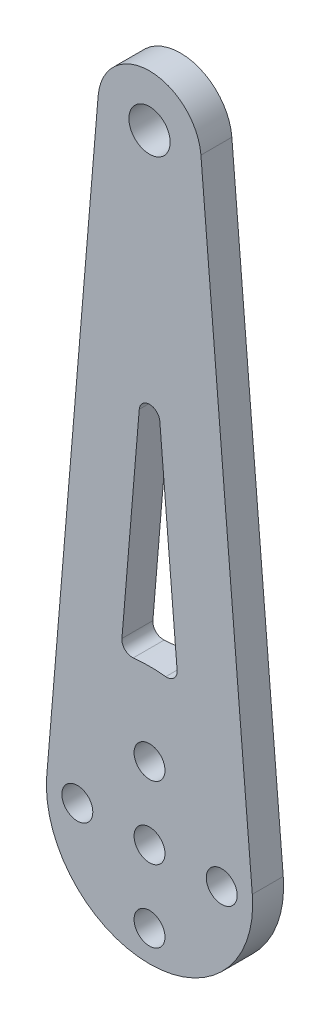
ISO-10303-21;
HEADER;
FILE_DESCRIPTION(('STEP AP214'),'2;1');
FILE_NAME('part.step','',(''),(''),'','','');
FILE_SCHEMA(('AUTOMOTIVE_DESIGN { 1 0 10303 214 1 1 1 1 }'));
ENDSEC;
DATA;
#1=APPLICATION_CONTEXT('core data for automotive mechanical design processes');
#2=APPLICATION_PROTOCOL_DEFINITION('international standard','automotive_design',2000,#1);
#3=PRODUCT_CONTEXT('',#1,'mechanical');
#4=PRODUCT('Part','Part','',(#3));
#5=PRODUCT_RELATED_PRODUCT_CATEGORY('part','',(#4));
#6=PRODUCT_DEFINITION_FORMATION('','',#4);
#7=PRODUCT_DEFINITION_CONTEXT('part definition',#1,'design');
#8=PRODUCT_DEFINITION('design','',#6,#7);
#9=PRODUCT_DEFINITION_SHAPE('','',#8);
#10=(LENGTH_UNIT() NAMED_UNIT(*) SI_UNIT(.MILLI.,.METRE.));
#11=(NAMED_UNIT(*) PLANE_ANGLE_UNIT() SI_UNIT($,.RADIAN.));
#12=(NAMED_UNIT(*) SI_UNIT($,.STERADIAN.) SOLID_ANGLE_UNIT());
#13=UNCERTAINTY_MEASURE_WITH_UNIT(LENGTH_MEASURE(1.E-05),#10,'distance_accuracy_value','');
#14=(GEOMETRIC_REPRESENTATION_CONTEXT(3) GLOBAL_UNCERTAINTY_ASSIGNED_CONTEXT((#13)) GLOBAL_UNIT_ASSIGNED_CONTEXT((#10,
#11,#12)) REPRESENTATION_CONTEXT('',''));
#15=CARTESIAN_POINT('',(0.,0.,0.));
#16=DIRECTION('',(0.,0.,1.));
#17=DIRECTION('',(1.,0.,0.));
#18=AXIS2_PLACEMENT_3D('',#15,#16,#17);
#19=CARTESIAN_POINT('',(0.,0.,3.));
#20=DIRECTION('',(0.,0.,1.));
#21=DIRECTION('',(1.,0.,0.));
#22=AXIS2_PLACEMENT_3D('',#19,#20,#21);
#23=PLANE('',#22);
#24=CARTESIAN_POINT('',(0.,36.,3.));
#25=DIRECTION('',(0.,0.,1.));
#26=DIRECTION('',(-1.,0.,0.));
#27=AXIS2_PLACEMENT_3D('',#24,#25,#26);
#28=CIRCLE('',#27,1.);
#29=CARTESIAN_POINT('',(0.996521728591825,36.0833333333328,3.));
#30=VERTEX_POINT('',#29);
#31=CARTESIAN_POINT('',(-0.996521728591826,36.0833333333328,3.));
#32=VERTEX_POINT('',#31);
#33=EDGE_CURVE('E55',#30,#32,#28,.T.);
#34=ORIENTED_EDGE('',*,*,#33,.F.);
#35=DIRECTION('',(-0.0833333333333331,0.996521728591783,0.));
#36=VECTOR('',#35,1.);
#37=CARTESIAN_POINT('',(2.67640077724199,15.994901652701,3.));
#38=LINE('',#37,#36);
#39=CARTESIAN_POINT('',(2.67640077724198,15.994901652701,3.));
#40=VERTEX_POINT('',#39);
#41=EDGE_CURVE('E139',#40,#30,#38,.T.);
#42=ORIENTED_EDGE('',*,*,#41,.F.);
#43=CARTESIAN_POINT('',(1.6798790486502,15.9115683193677,3.));
#44=DIRECTION('',(0.,0.,1.));
#45=DIRECTION('',(1.,0.,0.));
#46=AXIS2_PLACEMENT_3D('',#43,#44,#45);
#47=CIRCLE('',#46,0.999999999999998);
#48=CARTESIAN_POINT('',(1.57488660810956,14.9170952994072,3.));
#49=VERTEX_POINT('',#48);
#50=EDGE_CURVE('E143',#49,#40,#47,.T.);
#51=ORIENTED_EDGE('',*,*,#50,.F.);
#52=CARTESIAN_POINT('',(0.,0.,3.));
#53=DIRECTION('',(0.,0.,-1.));
#54=DIRECTION('',(1.,0.,0.));
#55=AXIS2_PLACEMENT_3D('',#52,#53,#54);
#56=CIRCLE('',#55,15.);
#57=CARTESIAN_POINT('',(-1.57488660810957,14.9170952994072,3.));
#58=VERTEX_POINT('',#57);
#59=EDGE_CURVE('E166',#58,#49,#56,.T.);
#60=ORIENTED_EDGE('',*,*,#59,.F.);
#61=CARTESIAN_POINT('',(-1.6798790486502,15.9115683193677,3.));
#62=DIRECTION('',(0.,0.,1.));
#63=DIRECTION('',(-1.,0.,0.));
#64=AXIS2_PLACEMENT_3D('',#61,#62,#63);
#65=CIRCLE('',#64,0.999999999999998);
#66=CARTESIAN_POINT('',(-2.67640077724199,15.994901652701,3.));
#67=VERTEX_POINT('',#66);
#68=EDGE_CURVE('E162',#67,#58,#65,.T.);
#69=ORIENTED_EDGE('',*,*,#68,.F.);
#70=DIRECTION('',(-0.0833333333333332,-0.996521728591783,0.));
#71=VECTOR('',#70,1.);
#72=CARTESIAN_POINT('',(-0.996521728591825,36.0833333333328,3.));
#73=LINE('',#72,#71);
#74=EDGE_CURVE('E159',#32,#67,#73,.T.);
#75=ORIENTED_EDGE('',*,*,#74,.F.);
#76=EDGE_LOOP('',(#34,#42,#51,#60,#69,#75));
#77=FACE_BOUND('',#76,.T.);
#78=CARTESIAN_POINT('',(-7.,0.,3.));
#79=DIRECTION('',(0.,0.,1.));
#80=DIRECTION('',(1.,0.,0.));
#81=AXIS2_PLACEMENT_3D('',#78,#79,#80);
#82=CIRCLE('',#81,1.5);
#83=CARTESIAN_POINT('',(-5.5,0.,3.));
#84=VERTEX_POINT('',#83);
#85=EDGE_CURVE('E196',#84,#84,#82,.T.);
#86=ORIENTED_EDGE('',*,*,#85,.F.);
#87=EDGE_LOOP('',(#86));
#88=FACE_BOUND('',#87,.T.);
#89=CARTESIAN_POINT('',(7.,0.,3.));
#90=DIRECTION('',(0.,0.,1.));
#91=DIRECTION('',(1.,0.,0.));
#92=AXIS2_PLACEMENT_3D('',#89,#90,#91);
#93=CIRCLE('',#92,1.5);
#94=CARTESIAN_POINT('',(8.5,0.,3.));
#95=VERTEX_POINT('',#94);
#96=EDGE_CURVE('E212',#95,#95,#93,.T.);
#97=ORIENTED_EDGE('',*,*,#96,.F.);
#98=EDGE_LOOP('',(#97));
#99=FACE_BOUND('',#98,.T.);
#100=CARTESIAN_POINT('',(0.,0.,3.));
#101=DIRECTION('',(0.,0.,1.));
#102=DIRECTION('',(1.,0.,0.));
#103=AXIS2_PLACEMENT_3D('',#100,#101,#102);
#104=CIRCLE('',#103,1.5);
#105=CARTESIAN_POINT('',(1.5,0.,3.));
#106=VERTEX_POINT('',#105);
#107=EDGE_CURVE('E228',#106,#106,#104,.T.);
#108=ORIENTED_EDGE('',*,*,#107,.F.);
#109=EDGE_LOOP('',(#108));
#110=FACE_BOUND('',#109,.T.);
#111=CARTESIAN_POINT('',(0.,0.,3.));
#112=DIRECTION('',(0.,0.,1.));
#113=DIRECTION('',(1.,0.,0.));
#114=AXIS2_PLACEMENT_3D('',#111,#112,#113);
#115=CIRCLE('',#114,9.99999999999999);
#116=CARTESIAN_POINT('',(-9.96521728591783,0.833333333333333,3.));
#117=VERTEX_POINT('',#116);
#118=CARTESIAN_POINT('',(9.96521728591783,0.833333333333333,3.));
#119=VERTEX_POINT('',#118);
#120=EDGE_CURVE('E236',#117,#119,#115,.T.);
#121=ORIENTED_EDGE('',*,*,#120,.T.);
#122=DIRECTION('',(-0.0833333333333333,0.996521728591783,0.));
#123=VECTOR('',#122,1.);
#124=CARTESIAN_POINT('',(4.98260864295891,60.4166666666667,3.));
#125=LINE('',#124,#123);
#126=CARTESIAN_POINT('',(4.98260864295891,60.4166666666667,3.));
#127=VERTEX_POINT('',#126);
#128=EDGE_CURVE('E240',#119,#127,#125,.T.);
#129=ORIENTED_EDGE('',*,*,#128,.T.);
#130=CARTESIAN_POINT('',(0.,60.,3.));
#131=DIRECTION('',(0.,0.,1.));
#132=DIRECTION('',(1.,0.,0.));
#133=AXIS2_PLACEMENT_3D('',#130,#131,#132);
#134=CIRCLE('',#133,5.);
#135=CARTESIAN_POINT('',(-4.98260864295891,60.4166666666667,3.));
#136=VERTEX_POINT('',#135);
#137=EDGE_CURVE('E244',#127,#136,#134,.T.);
#138=ORIENTED_EDGE('',*,*,#137,.T.);
#139=DIRECTION('',(-0.0833333333333333,-0.996521728591783,0.));
#140=VECTOR('',#139,1.);
#141=CARTESIAN_POINT('',(-9.96521728591783,0.833333333333333,3.));
#142=LINE('',#141,#140);
#143=EDGE_CURVE('E247',#136,#117,#142,.T.);
#144=ORIENTED_EDGE('',*,*,#143,.T.);
#145=EDGE_LOOP('',(#121,#129,#138,#144));
#146=FACE_BOUND('',#145,.T.);
#147=CARTESIAN_POINT('',(0.,7.,3.));
#148=DIRECTION('',(0.,0.,1.));
#149=DIRECTION('',(1.,0.,0.));
#150=AXIS2_PLACEMENT_3D('',#147,#148,#149);
#151=CIRCLE('',#150,1.5);
#152=CARTESIAN_POINT('',(1.5,7.,3.));
#153=VERTEX_POINT('',#152);
#154=EDGE_CURVE('E220',#153,#153,#151,.T.);
#155=ORIENTED_EDGE('',*,*,#154,.F.);
#156=EDGE_LOOP('',(#155));
#157=FACE_BOUND('',#156,.T.);
#158=CARTESIAN_POINT('',(0.,-7.,3.));
#159=DIRECTION('',(0.,0.,1.));
#160=DIRECTION('',(1.,0.,0.));
#161=AXIS2_PLACEMENT_3D('',#158,#159,#160);
#162=CIRCLE('',#161,1.5);
#163=CARTESIAN_POINT('',(1.5,-7.,3.));
#164=VERTEX_POINT('',#163);
#165=EDGE_CURVE('E204',#164,#164,#162,.T.);
#166=ORIENTED_EDGE('',*,*,#165,.F.);
#167=EDGE_LOOP('',(#166));
#168=FACE_BOUND('',#167,.T.);
#169=CARTESIAN_POINT('',(0.,60.,3.));
#170=DIRECTION('',(0.,0.,1.));
#171=DIRECTION('',(1.,0.,0.));
#172=AXIS2_PLACEMENT_3D('',#169,#170,#171);
#173=CIRCLE('',#172,2.);
#174=CARTESIAN_POINT('',(2.,60.,3.));
#175=VERTEX_POINT('',#174);
#176=EDGE_CURVE('E188',#175,#175,#173,.T.);
#177=ORIENTED_EDGE('',*,*,#176,.F.);
#178=EDGE_LOOP('',(#177));
#179=FACE_BOUND('',#178,.T.);
#180=ADVANCED_FACE('F39',(#77,#88,#99,#110,#146,#157,#168,#179),#23,.T.);
#181=CARTESIAN_POINT('',(0.,0.,0.));
#182=DIRECTION('',(0.,0.,1.));
#183=DIRECTION('',(1.,0.,0.));
#184=AXIS2_PLACEMENT_3D('',#181,#182,#183);
#185=PLANE('',#184);
#186=DIRECTION('',(-0.0833333333333331,0.996521728591783,0.));
#187=VECTOR('',#186,1.);
#188=CARTESIAN_POINT('',(2.67640077724199,15.994901652701,0.));
#189=LINE('',#188,#187);
#190=CARTESIAN_POINT('',(2.67640077724198,15.994901652701,0.));
#191=VERTEX_POINT('',#190);
#192=CARTESIAN_POINT('',(0.996521728591825,36.0833333333328,0.));
#193=VERTEX_POINT('',#192);
#194=EDGE_CURVE('E126',#191,#193,#189,.T.);
#195=ORIENTED_EDGE('',*,*,#194,.T.);
#196=CARTESIAN_POINT('',(0.,36.,0.));
#197=DIRECTION('',(0.,0.,1.));
#198=DIRECTION('',(-1.,0.,0.));
#199=AXIS2_PLACEMENT_3D('',#196,#197,#198);
#200=CIRCLE('',#199,1.);
#201=CARTESIAN_POINT('',(-0.996521728591825,36.0833333333328,0.));
#202=VERTEX_POINT('',#201);
#203=EDGE_CURVE('E119',#193,#202,#200,.T.);
#204=ORIENTED_EDGE('',*,*,#203,.T.);
#205=DIRECTION('',(-0.0833333333333332,-0.996521728591783,0.));
#206=VECTOR('',#205,1.);
#207=CARTESIAN_POINT('',(-0.996521728591825,36.0833333333328,0.));
#208=LINE('',#207,#206);
#209=CARTESIAN_POINT('',(-2.67640077724199,15.994901652701,0.));
#210=VERTEX_POINT('',#209);
#211=EDGE_CURVE('E129',#202,#210,#208,.T.);
#212=ORIENTED_EDGE('',*,*,#211,.T.);
#213=CARTESIAN_POINT('',(-1.6798790486502,15.9115683193677,0.));
#214=DIRECTION('',(0.,0.,1.));
#215=DIRECTION('',(-1.,0.,0.));
#216=AXIS2_PLACEMENT_3D('',#213,#214,#215);
#217=CIRCLE('',#216,0.999999999999998);
#218=CARTESIAN_POINT('',(-1.57488660810957,14.9170952994072,0.));
#219=VERTEX_POINT('',#218);
#220=EDGE_CURVE('E63',#210,#219,#217,.T.);
#221=ORIENTED_EDGE('',*,*,#220,.T.);
#222=CARTESIAN_POINT('',(0.,0.,0.));
#223=DIRECTION('',(0.,0.,-1.));
#224=DIRECTION('',(1.,0.,0.));
#225=AXIS2_PLACEMENT_3D('',#222,#223,#224);
#226=CIRCLE('',#225,15.);
#227=CARTESIAN_POINT('',(1.57488660810956,14.9170952994072,0.));
#228=VERTEX_POINT('',#227);
#229=EDGE_CURVE('E148',#219,#228,#226,.T.);
#230=ORIENTED_EDGE('',*,*,#229,.T.);
#231=CARTESIAN_POINT('',(1.6798790486502,15.9115683193677,0.));
#232=DIRECTION('',(0.,0.,1.));
#233=DIRECTION('',(1.,0.,0.));
#234=AXIS2_PLACEMENT_3D('',#231,#232,#233);
#235=CIRCLE('',#234,0.999999999999998);
#236=EDGE_CURVE('E152',#228,#191,#235,.T.);
#237=ORIENTED_EDGE('',*,*,#236,.T.);
#238=EDGE_LOOP('',(#195,#204,#212,#221,#230,#237));
#239=FACE_BOUND('',#238,.T.);
#240=CARTESIAN_POINT('',(0.,0.,0.));
#241=DIRECTION('',(0.,0.,1.));
#242=DIRECTION('',(1.,0.,0.));
#243=AXIS2_PLACEMENT_3D('',#240,#241,#242);
#244=CIRCLE('',#243,9.99999999999999);
#245=CARTESIAN_POINT('',(-9.96521728591783,0.833333333333333,0.));
#246=VERTEX_POINT('',#245);
#247=CARTESIAN_POINT('',(9.96521728591783,0.833333333333333,0.));
#248=VERTEX_POINT('',#247);
#249=EDGE_CURVE('E232',#246,#248,#244,.T.);
#250=ORIENTED_EDGE('',*,*,#249,.F.);
#251=DIRECTION('',(-0.0833333333333333,-0.996521728591783,0.));
#252=VECTOR('',#251,1.);
#253=CARTESIAN_POINT('',(-9.96521728591783,0.833333333333333,0.));
#254=LINE('',#253,#252);
#255=CARTESIAN_POINT('',(-4.98260864295891,60.4166666666667,0.));
#256=VERTEX_POINT('',#255);
#257=EDGE_CURVE('E241',#256,#246,#254,.T.);
#258=ORIENTED_EDGE('',*,*,#257,.F.);
#259=CARTESIAN_POINT('',(0.,60.,0.));
#260=DIRECTION('',(0.,0.,1.));
#261=DIRECTION('',(1.,0.,0.));
#262=AXIS2_PLACEMENT_3D('',#259,#260,#261);
#263=CIRCLE('',#262,5.);
#264=CARTESIAN_POINT('',(4.98260864295891,60.4166666666667,0.));
#265=VERTEX_POINT('',#264);
#266=EDGE_CURVE('E257',#265,#256,#263,.T.);
#267=ORIENTED_EDGE('',*,*,#266,.F.);
#268=DIRECTION('',(-0.0833333333333333,0.996521728591783,0.));
#269=VECTOR('',#268,1.);
#270=CARTESIAN_POINT('',(4.98260864295891,60.4166666666667,0.));
#271=LINE('',#270,#269);
#272=EDGE_CURVE('E254',#248,#265,#271,.T.);
#273=ORIENTED_EDGE('',*,*,#272,.F.);
#274=EDGE_LOOP('',(#250,#258,#267,#273));
#275=FACE_BOUND('',#274,.T.);
#276=CARTESIAN_POINT('',(0.,0.,0.));
#277=DIRECTION('',(0.,0.,1.));
#278=DIRECTION('',(1.,0.,0.));
#279=AXIS2_PLACEMENT_3D('',#276,#277,#278);
#280=CIRCLE('',#279,1.5);
#281=CARTESIAN_POINT('',(1.5,0.,0.));
#282=VERTEX_POINT('',#281);
#283=EDGE_CURVE('E224',#282,#282,#280,.T.);
#284=ORIENTED_EDGE('',*,*,#283,.T.);
#285=EDGE_LOOP('',(#284));
#286=FACE_BOUND('',#285,.T.);
#287=CARTESIAN_POINT('',(0.,7.,0.));
#288=DIRECTION('',(0.,0.,1.));
#289=DIRECTION('',(1.,0.,0.));
#290=AXIS2_PLACEMENT_3D('',#287,#288,#289);
#291=CIRCLE('',#290,1.5);
#292=CARTESIAN_POINT('',(1.5,7.,0.));
#293=VERTEX_POINT('',#292);
#294=EDGE_CURVE('E216',#293,#293,#291,.T.);
#295=ORIENTED_EDGE('',*,*,#294,.T.);
#296=EDGE_LOOP('',(#295));
#297=FACE_BOUND('',#296,.T.);
#298=CARTESIAN_POINT('',(7.,0.,0.));
#299=DIRECTION('',(0.,0.,1.));
#300=DIRECTION('',(1.,0.,0.));
#301=AXIS2_PLACEMENT_3D('',#298,#299,#300);
#302=CIRCLE('',#301,1.5);
#303=CARTESIAN_POINT('',(8.5,0.,0.));
#304=VERTEX_POINT('',#303);
#305=EDGE_CURVE('E208',#304,#304,#302,.T.);
#306=ORIENTED_EDGE('',*,*,#305,.T.);
#307=EDGE_LOOP('',(#306));
#308=FACE_BOUND('',#307,.T.);
#309=CARTESIAN_POINT('',(0.,-7.,0.));
#310=DIRECTION('',(0.,0.,1.));
#311=DIRECTION('',(1.,0.,0.));
#312=AXIS2_PLACEMENT_3D('',#309,#310,#311);
#313=CIRCLE('',#312,1.5);
#314=CARTESIAN_POINT('',(1.5,-7.,0.));
#315=VERTEX_POINT('',#314);
#316=EDGE_CURVE('E200',#315,#315,#313,.T.);
#317=ORIENTED_EDGE('',*,*,#316,.T.);
#318=EDGE_LOOP('',(#317));
#319=FACE_BOUND('',#318,.T.);
#320=CARTESIAN_POINT('',(-7.,0.,0.));
#321=DIRECTION('',(0.,0.,1.));
#322=DIRECTION('',(1.,0.,0.));
#323=AXIS2_PLACEMENT_3D('',#320,#321,#322);
#324=CIRCLE('',#323,1.5);
#325=CARTESIAN_POINT('',(-5.5,0.,0.));
#326=VERTEX_POINT('',#325);
#327=EDGE_CURVE('E192',#326,#326,#324,.T.);
#328=ORIENTED_EDGE('',*,*,#327,.T.);
#329=EDGE_LOOP('',(#328));
#330=FACE_BOUND('',#329,.T.);
#331=CARTESIAN_POINT('',(0.,60.,0.));
#332=DIRECTION('',(0.,0.,1.));
#333=DIRECTION('',(1.,0.,0.));
#334=AXIS2_PLACEMENT_3D('',#331,#332,#333);
#335=CIRCLE('',#334,2.);
#336=CARTESIAN_POINT('',(2.,60.,0.));
#337=VERTEX_POINT('',#336);
#338=EDGE_CURVE('E176',#337,#337,#335,.T.);
#339=ORIENTED_EDGE('',*,*,#338,.T.);
#340=EDGE_LOOP('',(#339));
#341=FACE_BOUND('',#340,.T.);
#342=ADVANCED_FACE('F134',(#239,#275,#286,#297,#308,#319,#330,#341),#185,.F.);
#343=CARTESIAN_POINT('',(0.,0.,3.));
#344=DIRECTION('',(0.,0.,-1.));
#345=DIRECTION('',(-1.,0.,0.));
#346=AXIS2_PLACEMENT_3D('',#343,#344,#345);
#347=CYLINDRICAL_SURFACE('',#346,9.99999999999999);
#348=ORIENTED_EDGE('',*,*,#249,.T.);
#349=DIRECTION('',(0.,0.,-1.));
#350=VECTOR('',#349,1.);
#351=CARTESIAN_POINT('',(9.96521728591783,0.833333333333333,3.));
#352=LINE('',#351,#350);
#353=EDGE_CURVE('E11',#119,#248,#352,.T.);
#354=ORIENTED_EDGE('',*,*,#353,.F.);
#355=ORIENTED_EDGE('',*,*,#120,.F.);
#356=DIRECTION('',(0.,0.,-1.));
#357=VECTOR('',#356,1.);
#358=CARTESIAN_POINT('',(-9.96521728591783,0.833333333333333,3.));
#359=LINE('',#358,#357);
#360=EDGE_CURVE('E250',#117,#246,#359,.T.);
#361=ORIENTED_EDGE('',*,*,#360,.T.);
#362=EDGE_LOOP('',(#348,#354,#355,#361));
#363=FACE_BOUND('',#362,.T.);
#364=ADVANCED_FACE('F41',(#363),#347,.T.);
#365=CARTESIAN_POINT('',(4.98260864295891,60.4166666666667,3.));
#366=DIRECTION('',(-0.996521728591783,-0.0833333333333333,0.));
#367=DIRECTION('',(0.0833333333333333,-0.996521728591783,0.));
#368=AXIS2_PLACEMENT_3D('',#365,#366,#367);
#369=PLANE('',#368);
#370=ORIENTED_EDGE('',*,*,#272,.T.);
#371=DIRECTION('',(0.,0.,-1.));
#372=VECTOR('',#371,1.);
#373=CARTESIAN_POINT('',(4.98260864295891,60.4166666666667,3.));
#374=LINE('',#373,#372);
#375=EDGE_CURVE('E48',#127,#265,#374,.T.);
#376=ORIENTED_EDGE('',*,*,#375,.F.);
#377=ORIENTED_EDGE('',*,*,#128,.F.);
#378=ORIENTED_EDGE('',*,*,#353,.T.);
#379=EDGE_LOOP('',(#370,#376,#377,#378));
#380=FACE_BOUND('',#379,.T.);
#381=ADVANCED_FACE('F289',(#380),#369,.F.);
#382=CARTESIAN_POINT('',(0.,60.,3.));
#383=DIRECTION('',(0.,0.,-1.));
#384=DIRECTION('',(-1.,0.,0.));
#385=AXIS2_PLACEMENT_3D('',#382,#383,#384);
#386=CYLINDRICAL_SURFACE('',#385,5.);
#387=ORIENTED_EDGE('',*,*,#266,.T.);
#388=DIRECTION('',(0.,0.,-1.));
#389=VECTOR('',#388,1.);
#390=CARTESIAN_POINT('',(-4.98260864295891,60.4166666666667,3.));
#391=LINE('',#390,#389);
#392=EDGE_CURVE('E265',#136,#256,#391,.T.);
#393=ORIENTED_EDGE('',*,*,#392,.F.);
#394=ORIENTED_EDGE('',*,*,#137,.F.);
#395=ORIENTED_EDGE('',*,*,#375,.T.);
#396=EDGE_LOOP('',(#387,#393,#394,#395));
#397=FACE_BOUND('',#396,.T.);
#398=ADVANCED_FACE('F274',(#397),#386,.T.);
#399=CARTESIAN_POINT('',(-9.96521728591783,0.833333333333333,3.));
#400=DIRECTION('',(0.996521728591783,-0.0833333333333333,0.));
#401=DIRECTION('',(0.0833333333333333,0.996521728591783,0.));
#402=AXIS2_PLACEMENT_3D('',#399,#400,#401);
#403=PLANE('',#402);
#404=ORIENTED_EDGE('',*,*,#257,.T.);
#405=ORIENTED_EDGE('',*,*,#360,.F.);
#406=ORIENTED_EDGE('',*,*,#143,.F.);
#407=ORIENTED_EDGE('',*,*,#392,.T.);
#408=EDGE_LOOP('',(#404,#405,#406,#407));
#409=FACE_BOUND('',#408,.T.);
#410=ADVANCED_FACE('F282',(#409),#403,.F.);
#411=CARTESIAN_POINT('',(0.,0.,3.));
#412=DIRECTION('',(0.,0.,-1.));
#413=DIRECTION('',(-1.,0.,0.));
#414=AXIS2_PLACEMENT_3D('',#411,#412,#413);
#415=CYLINDRICAL_SURFACE('',#414,1.5);
#416=ORIENTED_EDGE('',*,*,#107,.T.);
#417=EDGE_LOOP('',(#416));
#418=FACE_BOUND('',#417,.T.);
#419=ORIENTED_EDGE('',*,*,#283,.F.);
#420=EDGE_LOOP('',(#419));
#421=FACE_BOUND('',#420,.T.);
#422=ADVANCED_FACE('F305',(#418,#421),#415,.F.);
#423=CARTESIAN_POINT('',(0.,7.,3.));
#424=DIRECTION('',(0.,0.,-1.));
#425=DIRECTION('',(-1.,0.,0.));
#426=AXIS2_PLACEMENT_3D('',#423,#424,#425);
#427=CYLINDRICAL_SURFACE('',#426,1.5);
#428=ORIENTED_EDGE('',*,*,#154,.T.);
#429=EDGE_LOOP('',(#428));
#430=FACE_BOUND('',#429,.T.);
#431=ORIENTED_EDGE('',*,*,#294,.F.);
#432=EDGE_LOOP('',(#431));
#433=FACE_BOUND('',#432,.T.);
#434=ADVANCED_FACE('F312',(#430,#433),#427,.F.);
#435=CARTESIAN_POINT('',(7.,0.,3.));
#436=DIRECTION('',(0.,0.,-1.));
#437=DIRECTION('',(-1.,0.,0.));
#438=AXIS2_PLACEMENT_3D('',#435,#436,#437);
#439=CYLINDRICAL_SURFACE('',#438,1.5);
#440=ORIENTED_EDGE('',*,*,#96,.T.);
#441=EDGE_LOOP('',(#440));
#442=FACE_BOUND('',#441,.T.);
#443=ORIENTED_EDGE('',*,*,#305,.F.);
#444=EDGE_LOOP('',(#443));
#445=FACE_BOUND('',#444,.T.);
#446=ADVANCED_FACE('F317',(#442,#445),#439,.F.);
#447=CARTESIAN_POINT('',(0.,-7.,3.));
#448=DIRECTION('',(0.,0.,-1.));
#449=DIRECTION('',(-1.,0.,0.));
#450=AXIS2_PLACEMENT_3D('',#447,#448,#449);
#451=CYLINDRICAL_SURFACE('',#450,1.5);
#452=ORIENTED_EDGE('',*,*,#165,.T.);
#453=EDGE_LOOP('',(#452));
#454=FACE_BOUND('',#453,.T.);
#455=ORIENTED_EDGE('',*,*,#316,.F.);
#456=EDGE_LOOP('',(#455));
#457=FACE_BOUND('',#456,.T.);
#458=ADVANCED_FACE('F344',(#454,#457),#451,.F.);
#459=CARTESIAN_POINT('',(-7.,0.,3.));
#460=DIRECTION('',(0.,0.,-1.));
#461=DIRECTION('',(-1.,0.,0.));
#462=AXIS2_PLACEMENT_3D('',#459,#460,#461);
#463=CYLINDRICAL_SURFACE('',#462,1.5);
#464=ORIENTED_EDGE('',*,*,#85,.T.);
#465=EDGE_LOOP('',(#464));
#466=FACE_BOUND('',#465,.T.);
#467=ORIENTED_EDGE('',*,*,#327,.F.);
#468=EDGE_LOOP('',(#467));
#469=FACE_BOUND('',#468,.T.);
#470=ADVANCED_FACE('F335',(#466,#469),#463,.F.);
#471=CARTESIAN_POINT('',(0.,60.,3.));
#472=DIRECTION('',(0.,0.,-1.));
#473=DIRECTION('',(-1.,0.,0.));
#474=AXIS2_PLACEMENT_3D('',#471,#472,#473);
#475=CYLINDRICAL_SURFACE('',#474,2.);
#476=ORIENTED_EDGE('',*,*,#176,.T.);
#477=EDGE_LOOP('',(#476));
#478=FACE_BOUND('',#477,.T.);
#479=ORIENTED_EDGE('',*,*,#338,.F.);
#480=EDGE_LOOP('',(#479));
#481=FACE_BOUND('',#480,.T.);
#482=ADVANCED_FACE('F333',(#478,#481),#475,.F.);
#483=CARTESIAN_POINT('',(0.,36.,0.));
#484=DIRECTION('',(0.,0.,1.));
#485=DIRECTION('',(1.,0.,0.));
#486=AXIS2_PLACEMENT_3D('',#483,#484,#485);
#487=CYLINDRICAL_SURFACE('',#486,1.);
#488=ORIENTED_EDGE('',*,*,#33,.T.);
#489=DIRECTION('',(0.,0.,1.));
#490=VECTOR('',#489,1.);
#491=CARTESIAN_POINT('',(-0.996521728591825,36.0833333333328,0.));
#492=LINE('',#491,#490);
#493=EDGE_CURVE('E115',#202,#32,#492,.T.);
#494=ORIENTED_EDGE('',*,*,#493,.F.);
#495=ORIENTED_EDGE('',*,*,#203,.F.);
#496=DIRECTION('',(0.,0.,1.));
#497=VECTOR('',#496,1.);
#498=CARTESIAN_POINT('',(0.996521728591825,36.0833333333328,0.));
#499=LINE('',#498,#497);
#500=EDGE_CURVE('E173',#193,#30,#499,.T.);
#501=ORIENTED_EDGE('',*,*,#500,.T.);
#502=EDGE_LOOP('',(#488,#494,#495,#501));
#503=FACE_BOUND('',#502,.T.);
#504=ADVANCED_FACE('F117',(#503),#487,.F.);
#505=CARTESIAN_POINT('',(2.67640077724199,15.994901652701,0.));
#506=DIRECTION('',(0.996521728591783,0.0833333333333331,0.));
#507=DIRECTION('',(-0.0833333333333331,0.996521728591783,0.));
#508=AXIS2_PLACEMENT_3D('',#505,#506,#507);
#509=PLANE('',#508);
#510=ORIENTED_EDGE('',*,*,#41,.T.);
#511=ORIENTED_EDGE('',*,*,#500,.F.);
#512=ORIENTED_EDGE('',*,*,#194,.F.);
#513=DIRECTION('',(0.,0.,1.));
#514=VECTOR('',#513,1.);
#515=CARTESIAN_POINT('',(2.67640077724198,15.994901652701,0.));
#516=LINE('',#515,#514);
#517=EDGE_CURVE('E177',#191,#40,#516,.T.);
#518=ORIENTED_EDGE('',*,*,#517,.T.);
#519=EDGE_LOOP('',(#510,#511,#512,#518));
#520=FACE_BOUND('',#519,.T.);
#521=ADVANCED_FACE('F342',(#520),#509,.F.);
#522=CARTESIAN_POINT('',(1.6798790486502,15.9115683193677,0.));
#523=DIRECTION('',(0.,0.,1.));
#524=DIRECTION('',(1.,0.,0.));
#525=AXIS2_PLACEMENT_3D('',#522,#523,#524);
#526=CYLINDRICAL_SURFACE('',#525,0.999999999999998);
#527=ORIENTED_EDGE('',*,*,#50,.T.);
#528=ORIENTED_EDGE('',*,*,#517,.F.);
#529=ORIENTED_EDGE('',*,*,#236,.F.);
#530=DIRECTION('',(0.,0.,1.));
#531=VECTOR('',#530,1.);
#532=CARTESIAN_POINT('',(1.57488660810956,14.9170952994072,0.));
#533=LINE('',#532,#531);
#534=EDGE_CURVE('E180',#228,#49,#533,.T.);
#535=ORIENTED_EDGE('',*,*,#534,.T.);
#536=EDGE_LOOP('',(#527,#528,#529,#535));
#537=FACE_BOUND('',#536,.T.);
#538=ADVANCED_FACE('F400',(#537),#526,.F.);
#539=CARTESIAN_POINT('',(0.,0.,0.));
#540=DIRECTION('',(0.,0.,1.));
#541=DIRECTION('',(1.,0.,0.));
#542=AXIS2_PLACEMENT_3D('',#539,#540,#541);
#543=CYLINDRICAL_SURFACE('',#542,15.);
#544=ORIENTED_EDGE('',*,*,#59,.T.);
#545=ORIENTED_EDGE('',*,*,#534,.F.);
#546=ORIENTED_EDGE('',*,*,#229,.F.);
#547=DIRECTION('',(0.,0.,1.));
#548=VECTOR('',#547,1.);
#549=CARTESIAN_POINT('',(-1.57488660810957,14.9170952994072,0.));
#550=LINE('',#549,#548);
#551=EDGE_CURVE('E183',#219,#58,#550,.T.);
#552=ORIENTED_EDGE('',*,*,#551,.T.);
#553=EDGE_LOOP('',(#544,#545,#546,#552));
#554=FACE_BOUND('',#553,.T.);
#555=ADVANCED_FACE('F410',(#554),#543,.T.);
#556=CARTESIAN_POINT('',(-1.6798790486502,15.9115683193677,0.));
#557=DIRECTION('',(0.,0.,1.));
#558=DIRECTION('',(1.,0.,0.));
#559=AXIS2_PLACEMENT_3D('',#556,#557,#558);
#560=CYLINDRICAL_SURFACE('',#559,0.999999999999998);
#561=ORIENTED_EDGE('',*,*,#68,.T.);
#562=ORIENTED_EDGE('',*,*,#551,.F.);
#563=ORIENTED_EDGE('',*,*,#220,.F.);
#564=DIRECTION('',(0.,0.,1.));
#565=VECTOR('',#564,1.);
#566=CARTESIAN_POINT('',(-2.67640077724199,15.994901652701,0.));
#567=LINE('',#566,#565);
#568=EDGE_CURVE('E125',#210,#67,#567,.T.);
#569=ORIENTED_EDGE('',*,*,#568,.T.);
#570=EDGE_LOOP('',(#561,#562,#563,#569));
#571=FACE_BOUND('',#570,.T.);
#572=ADVANCED_FACE('F420',(#571),#560,.F.);
#573=CARTESIAN_POINT('',(-0.996521728591825,36.0833333333328,0.));
#574=DIRECTION('',(-0.996521728591783,0.0833333333333332,0.));
#575=DIRECTION('',(-0.0833333333333332,-0.996521728591783,0.));
#576=AXIS2_PLACEMENT_3D('',#573,#574,#575);
#577=PLANE('',#576);
#578=ORIENTED_EDGE('',*,*,#74,.T.);
#579=ORIENTED_EDGE('',*,*,#568,.F.);
#580=ORIENTED_EDGE('',*,*,#211,.F.);
#581=ORIENTED_EDGE('',*,*,#493,.T.);
#582=EDGE_LOOP('',(#578,#579,#580,#581));
#583=FACE_BOUND('',#582,.T.);
#584=ADVANCED_FACE('F130',(#583),#577,.F.);
#585=CLOSED_SHELL('',(#180,#342,#364,#381,#398,#410,#422,#434,#446,#458,#470,#482,#504,#521,
#538,#555,#572,#584));
#586=MANIFOLD_SOLID_BREP('B2',#585);
#587=ADVANCED_BREP_SHAPE_REPRESENTATION('',(#18,#586),#14);
#588=SHAPE_DEFINITION_REPRESENTATION(#9,#587);
ENDSEC;
END-ISO-10303-21;
